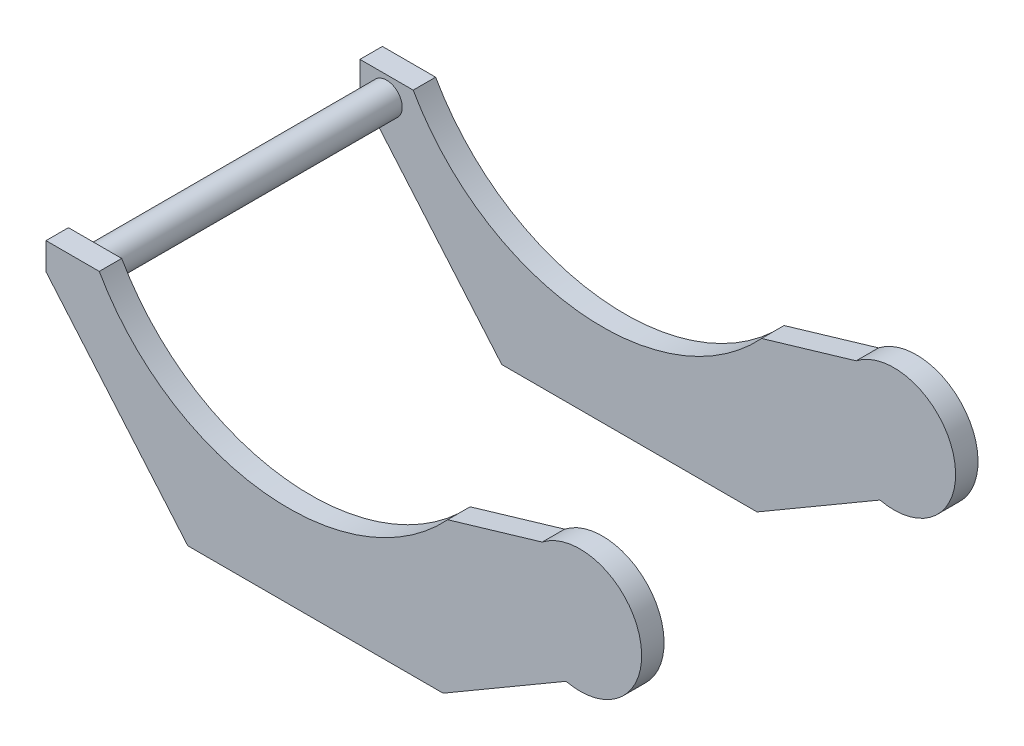
ISO-10303-21;
HEADER;
FILE_DESCRIPTION(('STEP AP214'),'2;1');
FILE_NAME('part.step','',(''),(''),'','','');
FILE_SCHEMA(('AUTOMOTIVE_DESIGN { 1 0 10303 214 1 1 1 1 }'));
ENDSEC;
DATA;
#1=APPLICATION_CONTEXT('core data for automotive mechanical design processes');
#2=APPLICATION_PROTOCOL_DEFINITION('international standard','automotive_design',2000,#1);
#3=PRODUCT_CONTEXT('',#1,'mechanical');
#4=PRODUCT('Part','Part','',(#3));
#5=PRODUCT_RELATED_PRODUCT_CATEGORY('part','',(#4));
#6=PRODUCT_DEFINITION_FORMATION('','',#4);
#7=PRODUCT_DEFINITION_CONTEXT('part definition',#1,'design');
#8=PRODUCT_DEFINITION('design','',#6,#7);
#9=PRODUCT_DEFINITION_SHAPE('','',#8);
#10=(LENGTH_UNIT() NAMED_UNIT(*) SI_UNIT(.MILLI.,.METRE.));
#11=(NAMED_UNIT(*) PLANE_ANGLE_UNIT() SI_UNIT($,.RADIAN.));
#12=(NAMED_UNIT(*) SI_UNIT($,.STERADIAN.) SOLID_ANGLE_UNIT());
#13=UNCERTAINTY_MEASURE_WITH_UNIT(LENGTH_MEASURE(1.E-05),#10,'distance_accuracy_value','');
#14=(GEOMETRIC_REPRESENTATION_CONTEXT(3) GLOBAL_UNCERTAINTY_ASSIGNED_CONTEXT((#13)) GLOBAL_UNIT_ASSIGNED_CONTEXT((#10,
#11,#12)) REPRESENTATION_CONTEXT('',''));
#15=CARTESIAN_POINT('',(0.,0.,0.));
#16=DIRECTION('',(0.,0.,1.));
#17=DIRECTION('',(1.,0.,0.));
#18=AXIS2_PLACEMENT_3D('',#15,#16,#17);
#19=CARTESIAN_POINT('',(-101.5,-3.62645786111999,-3.88949581364922));
#20=DIRECTION('',(0.,0.,1.));
#21=DIRECTION('',(1.,0.,0.));
#22=AXIS2_PLACEMENT_3D('',#19,#20,#21);
#23=CYLINDRICAL_SURFACE('',#22,2.78935799498713);
#24=CARTESIAN_POINT('',(-101.5,-3.62645786111999,4.));
#25=DIRECTION('',(0.,0.,1.));
#26=DIRECTION('',(1.,0.,0.));
#27=AXIS2_PLACEMENT_3D('',#24,#25,#26);
#28=CIRCLE('',#27,2.78935799498713);
#29=CARTESIAN_POINT('',(-98.7106420050129,-3.62645786111999,4.));
#30=VERTEX_POINT('',#29);
#31=EDGE_CURVE('E157',#30,#30,#28,.F.);
#32=ORIENTED_EDGE('',*,*,#31,.F.);
#33=EDGE_LOOP('',(#32));
#34=FACE_BOUND('',#33,.T.);
#35=CARTESIAN_POINT('',(-101.5,-3.62645786111999,56.));
#36=DIRECTION('',(0.,0.,1.));
#37=DIRECTION('',(1.,0.,0.));
#38=AXIS2_PLACEMENT_3D('',#35,#36,#37);
#39=CIRCLE('',#38,2.78935799498713);
#40=CARTESIAN_POINT('',(-98.7106420050129,-3.62645786111999,56.));
#41=VERTEX_POINT('',#40);
#42=EDGE_CURVE('E49',#41,#41,#39,.F.);
#43=ORIENTED_EDGE('',*,*,#42,.T.);
#44=EDGE_LOOP('',(#43));
#45=FACE_BOUND('',#44,.T.);
#46=ADVANCED_FACE('F45',(#34,#45),#23,.T.);
#47=CARTESIAN_POINT('',(-106.25,-4.81395348837209,4.));
#48=DIRECTION('',(1.,0.,0.));
#49=DIRECTION('',(0.,0.,-1.));
#50=AXIS2_PLACEMENT_3D('',#47,#48,#49);
#51=PLANE('',#50);
#52=DIRECTION('',(0.,-1.,0.));
#53=VECTOR('',#52,1.);
#54=CARTESIAN_POINT('',(-106.25,-4.81395348837209,0.));
#55=LINE('',#54,#53);
#56=CARTESIAN_POINT('',(-106.25,0.,0.));
#57=VERTEX_POINT('',#56);
#58=CARTESIAN_POINT('',(-106.25,-4.81395348837209,0.));
#59=VERTEX_POINT('',#58);
#60=EDGE_CURVE('E152',#57,#59,#55,.T.);
#61=ORIENTED_EDGE('',*,*,#60,.T.);
#62=DIRECTION('',(0.,0.,-1.));
#63=VECTOR('',#62,1.);
#64=CARTESIAN_POINT('',(-106.25,-4.81395348837209,4.));
#65=LINE('',#64,#63);
#66=CARTESIAN_POINT('',(-106.25,-4.81395348837209,4.));
#67=VERTEX_POINT('',#66);
#68=EDGE_CURVE('E11',#67,#59,#65,.T.);
#69=ORIENTED_EDGE('',*,*,#68,.F.);
#70=DIRECTION('',(0.,-1.,0.));
#71=VECTOR('',#70,1.);
#72=CARTESIAN_POINT('',(-106.25,-4.81395348837209,4.));
#73=LINE('',#72,#71);
#74=CARTESIAN_POINT('',(-106.25,0.,4.));
#75=VERTEX_POINT('',#74);
#76=EDGE_CURVE('E175',#75,#67,#73,.T.);
#77=ORIENTED_EDGE('',*,*,#76,.F.);
#78=DIRECTION('',(0.,0.,-1.));
#79=VECTOR('',#78,1.);
#80=CARTESIAN_POINT('',(-106.25,0.,4.));
#81=LINE('',#80,#79);
#82=EDGE_CURVE('E148',#75,#57,#81,.T.);
#83=ORIENTED_EDGE('',*,*,#82,.T.);
#84=EDGE_LOOP('',(#61,#69,#77,#83));
#85=FACE_BOUND('',#84,.T.);
#86=ADVANCED_FACE('F47',(#85),#51,.F.);
#87=CARTESIAN_POINT('',(-80.9523809523809,-34.5,4.));
#88=DIRECTION('',(0.761122912956319,0.648607671379924,0.));
#89=DIRECTION('',(-0.648607671379924,0.761122912956319,0.));
#90=AXIS2_PLACEMENT_3D('',#87,#88,#89);
#91=PLANE('',#90);
#92=DIRECTION('',(0.648607671379924,-0.761122912956319,0.));
#93=VECTOR('',#92,1.);
#94=CARTESIAN_POINT('',(-80.9523809523809,-34.5,0.));
#95=LINE('',#94,#93);
#96=CARTESIAN_POINT('',(-80.9523809523809,-34.5,0.));
#97=VERTEX_POINT('',#96);
#98=EDGE_CURVE('E156',#59,#97,#95,.T.);
#99=ORIENTED_EDGE('',*,*,#98,.T.);
#100=DIRECTION('',(0.,0.,-1.));
#101=VECTOR('',#100,1.);
#102=CARTESIAN_POINT('',(-80.9523809523809,-34.5,4.));
#103=LINE('',#102,#101);
#104=CARTESIAN_POINT('',(-80.9523809523809,-34.5,4.));
#105=VERTEX_POINT('',#104);
#106=EDGE_CURVE('E56',#105,#97,#103,.T.);
#107=ORIENTED_EDGE('',*,*,#106,.F.);
#108=DIRECTION('',(0.648607671379924,-0.761122912956319,0.));
#109=VECTOR('',#108,1.);
#110=CARTESIAN_POINT('',(-80.9523809523809,-34.5,4.));
#111=LINE('',#110,#109);
#112=EDGE_CURVE('E108',#67,#105,#111,.T.);
#113=ORIENTED_EDGE('',*,*,#112,.F.);
#114=ORIENTED_EDGE('',*,*,#68,.T.);
#115=EDGE_LOOP('',(#99,#107,#113,#114));
#116=FACE_BOUND('',#115,.T.);
#117=ADVANCED_FACE('F378',(#116),#91,.F.);
#118=CARTESIAN_POINT('',(-35.4166666666666,-34.5,4.));
#119=DIRECTION('',(0.,1.,0.));
#120=DIRECTION('',(-1.,0.,0.));
#121=AXIS2_PLACEMENT_3D('',#118,#119,#120);
#122=PLANE('',#121);
#123=DIRECTION('',(1.,0.,0.));
#124=VECTOR('',#123,1.);
#125=CARTESIAN_POINT('',(-35.4166666666666,-34.5,0.));
#126=LINE('',#125,#124);
#127=CARTESIAN_POINT('',(-35.4166666666666,-34.5,0.));
#128=VERTEX_POINT('',#127);
#129=EDGE_CURVE('E160',#97,#128,#126,.T.);
#130=ORIENTED_EDGE('',*,*,#129,.T.);
#131=DIRECTION('',(0.,0.,-1.));
#132=VECTOR('',#131,1.);
#133=CARTESIAN_POINT('',(-35.4166666666666,-34.5,4.));
#134=LINE('',#133,#132);
#135=CARTESIAN_POINT('',(-35.4166666666666,-34.5,4.));
#136=VERTEX_POINT('',#135);
#137=EDGE_CURVE('E186',#136,#128,#134,.T.);
#138=ORIENTED_EDGE('',*,*,#137,.F.);
#139=DIRECTION('',(1.,0.,0.));
#140=VECTOR('',#139,1.);
#141=CARTESIAN_POINT('',(-35.4166666666666,-34.5,4.));
#142=LINE('',#141,#140);
#143=EDGE_CURVE('E197',#105,#136,#142,.T.);
#144=ORIENTED_EDGE('',*,*,#143,.F.);
#145=ORIENTED_EDGE('',*,*,#106,.T.);
#146=EDGE_LOOP('',(#130,#138,#144,#145));
#147=FACE_BOUND('',#146,.T.);
#148=ADVANCED_FACE('F195',(#147),#122,.F.);
#149=CARTESIAN_POINT('',(-13.4920634920635,-21.6978501735579,4.));
#150=DIRECTION('',(-0.504247080861031,0.863559425542405,0.));
#151=DIRECTION('',(-0.863559425542405,-0.504247080861031,0.));
#152=AXIS2_PLACEMENT_3D('',#149,#150,#151);
#153=PLANE('',#152);
#154=DIRECTION('',(0.863559425542405,0.504247080861031,0.));
#155=VECTOR('',#154,1.);
#156=CARTESIAN_POINT('',(-13.4920634920635,-21.6978501735579,0.));
#157=LINE('',#156,#155);
#158=CARTESIAN_POINT('',(-13.4920634920635,-21.6978501735579,0.));
#159=VERTEX_POINT('',#158);
#160=EDGE_CURVE('E163',#128,#159,#157,.T.);
#161=ORIENTED_EDGE('',*,*,#160,.T.);
#162=DIRECTION('',(0.,0.,-1.));
#163=VECTOR('',#162,1.);
#164=CARTESIAN_POINT('',(-13.4920634920635,-21.6978501735579,4.));
#165=LINE('',#164,#163);
#166=CARTESIAN_POINT('',(-13.4920634920635,-21.6978501735579,4.));
#167=VERTEX_POINT('',#166);
#168=EDGE_CURVE('E182',#167,#159,#165,.T.);
#169=ORIENTED_EDGE('',*,*,#168,.F.);
#170=DIRECTION('',(0.863559425542405,0.504247080861031,0.));
#171=VECTOR('',#170,1.);
#172=CARTESIAN_POINT('',(-13.4920634920635,-21.6978501735579,4.));
#173=LINE('',#172,#171);
#174=EDGE_CURVE('E210',#136,#167,#173,.T.);
#175=ORIENTED_EDGE('',*,*,#174,.F.);
#176=ORIENTED_EDGE('',*,*,#137,.T.);
#177=EDGE_LOOP('',(#161,#169,#175,#176));
#178=FACE_BOUND('',#177,.T.);
#179=ADVANCED_FACE('F205',(#178),#153,.F.);
#180=CARTESIAN_POINT('',(-10.9928571428571,-10.9928571428571,4.));
#181=DIRECTION('',(0.,0.,-1.));
#182=DIRECTION('',(-1.,0.,0.));
#183=AXIS2_PLACEMENT_3D('',#180,#181,#182);
#184=CYLINDRICAL_SURFACE('',#183,10.9928571428571);
#185=CARTESIAN_POINT('',(-10.9928571428571,-10.9928571428571,0.));
#186=DIRECTION('',(0.,0.,1.));
#187=DIRECTION('',(-1.,0.,0.));
#188=AXIS2_PLACEMENT_3D('',#185,#186,#187);
#189=CIRCLE('',#188,10.9928571428571);
#190=CARTESIAN_POINT('',(-17.7388888888889,-2.31334311010179,0.));
#191=VERTEX_POINT('',#190);
#192=EDGE_CURVE('E166',#159,#191,#189,.T.);
#193=ORIENTED_EDGE('',*,*,#192,.T.);
#194=DIRECTION('',(0.,0.,-1.));
#195=VECTOR('',#194,1.);
#196=CARTESIAN_POINT('',(-17.7388888888889,-2.31334311010179,4.));
#197=LINE('',#196,#195);
#198=CARTESIAN_POINT('',(-17.7388888888889,-2.31334311010179,4.));
#199=VERTEX_POINT('',#198);
#200=EDGE_CURVE('E141',#199,#191,#197,.T.);
#201=ORIENTED_EDGE('',*,*,#200,.F.);
#202=CARTESIAN_POINT('',(-10.9928571428571,-10.9928571428571,4.));
#203=DIRECTION('',(0.,0.,1.));
#204=DIRECTION('',(-1.,0.,0.));
#205=AXIS2_PLACEMENT_3D('',#202,#203,#204);
#206=CIRCLE('',#205,10.9928571428571);
#207=EDGE_CURVE('E130',#167,#199,#206,.T.);
#208=ORIENTED_EDGE('',*,*,#207,.F.);
#209=ORIENTED_EDGE('',*,*,#168,.T.);
#210=EDGE_LOOP('',(#193,#201,#208,#209));
#211=FACE_BOUND('',#210,.T.);
#212=ADVANCED_FACE('F208',(#211),#184,.T.);
#213=CARTESIAN_POINT('',(-34.6039682539683,-7.29236612624806,4.));
#214=DIRECTION('',(0.283145224915242,-0.959077046752604,0.));
#215=DIRECTION('',(0.959077046752604,0.283145224915242,0.));
#216=AXIS2_PLACEMENT_3D('',#213,#214,#215);
#217=PLANE('',#216);
#218=DIRECTION('',(-0.959077046752604,-0.283145224915242,0.));
#219=VECTOR('',#218,1.);
#220=CARTESIAN_POINT('',(-34.6039682539683,-7.29236612624806,0.));
#221=LINE('',#220,#219);
#222=CARTESIAN_POINT('',(-34.6039682539683,-7.29236612624809,0.));
#223=VERTEX_POINT('',#222);
#224=EDGE_CURVE('E139',#191,#223,#221,.T.);
#225=ORIENTED_EDGE('',*,*,#224,.T.);
#226=DIRECTION('',(0.,0.,-1.));
#227=VECTOR('',#226,1.);
#228=CARTESIAN_POINT('',(-34.6039682539683,-7.29236612624809,4.));
#229=LINE('',#228,#227);
#230=CARTESIAN_POINT('',(-34.6039682539683,-7.29236612624809,4.));
#231=VERTEX_POINT('',#230);
#232=EDGE_CURVE('E136',#231,#223,#229,.T.);
#233=ORIENTED_EDGE('',*,*,#232,.F.);
#234=DIRECTION('',(-0.959077046752604,-0.283145224915242,0.));
#235=VECTOR('',#234,1.);
#236=CARTESIAN_POINT('',(-34.6039682539683,-7.29236612624806,4.));
#237=LINE('',#236,#235);
#238=EDGE_CURVE('E124',#199,#231,#237,.T.);
#239=ORIENTED_EDGE('',*,*,#238,.F.);
#240=ORIENTED_EDGE('',*,*,#200,.T.);
#241=EDGE_LOOP('',(#225,#233,#239,#240));
#242=FACE_BOUND('',#241,.T.);
#243=ADVANCED_FACE('F137',(#242),#217,.F.);
#244=CARTESIAN_POINT('',(-63.0198412698413,18.9981660404366,4.));
#245=DIRECTION('',(0.,0.,-1.));
#246=DIRECTION('',(-1.,0.,0.));
#247=AXIS2_PLACEMENT_3D('',#244,#245,#246);
#248=CYLINDRICAL_SURFACE('',#247,38.7124517547223);
#249=CARTESIAN_POINT('',(-63.0198412698413,18.9981660404366,0.));
#250=DIRECTION('',(0.,0.,-1.));
#251=DIRECTION('',(1.,0.,0.));
#252=AXIS2_PLACEMENT_3D('',#249,#250,#251);
#253=CIRCLE('',#252,38.7124517547223);
#254=CARTESIAN_POINT('',(-96.75,0.,0.));
#255=VERTEX_POINT('',#254);
#256=EDGE_CURVE('E94',#223,#255,#253,.T.);
#257=ORIENTED_EDGE('',*,*,#256,.T.);
#258=DIRECTION('',(0.,0.,-1.));
#259=VECTOR('',#258,1.);
#260=CARTESIAN_POINT('',(-96.75,0.,4.));
#261=LINE('',#260,#259);
#262=CARTESIAN_POINT('',(-96.75,0.,4.));
#263=VERTEX_POINT('',#262);
#264=EDGE_CURVE('E142',#263,#255,#261,.T.);
#265=ORIENTED_EDGE('',*,*,#264,.F.);
#266=CARTESIAN_POINT('',(-63.0198412698413,18.9981660404366,4.));
#267=DIRECTION('',(0.,0.,-1.));
#268=DIRECTION('',(1.,0.,0.));
#269=AXIS2_PLACEMENT_3D('',#266,#267,#268);
#270=CIRCLE('',#269,38.7124517547223);
#271=EDGE_CURVE('E128',#231,#263,#270,.T.);
#272=ORIENTED_EDGE('',*,*,#271,.F.);
#273=ORIENTED_EDGE('',*,*,#232,.T.);
#274=EDGE_LOOP('',(#257,#265,#272,#273));
#275=FACE_BOUND('',#274,.T.);
#276=ADVANCED_FACE('F144',(#275),#248,.F.);
#277=CARTESIAN_POINT('',(-106.25,0.,4.));
#278=DIRECTION('',(0.,-1.,0.));
#279=DIRECTION('',(0.,0.,-1.));
#280=AXIS2_PLACEMENT_3D('',#277,#278,#279);
#281=PLANE('',#280);
#282=DIRECTION('',(-1.,0.,0.));
#283=VECTOR('',#282,1.);
#284=CARTESIAN_POINT('',(-106.25,0.,0.));
#285=LINE('',#284,#283);
#286=EDGE_CURVE('E100',#255,#57,#285,.T.);
#287=ORIENTED_EDGE('',*,*,#286,.T.);
#288=ORIENTED_EDGE('',*,*,#82,.F.);
#289=DIRECTION('',(-1.,0.,0.));
#290=VECTOR('',#289,1.);
#291=CARTESIAN_POINT('',(-106.25,0.,4.));
#292=LINE('',#291,#290);
#293=EDGE_CURVE('E64',#263,#75,#292,.T.);
#294=ORIENTED_EDGE('',*,*,#293,.F.);
#295=ORIENTED_EDGE('',*,*,#264,.T.);
#296=EDGE_LOOP('',(#287,#288,#294,#295));
#297=FACE_BOUND('',#296,.T.);
#298=ADVANCED_FACE('F385',(#297),#281,.F.);
#299=CARTESIAN_POINT('',(-63.0198412698413,18.9981660404366,4.));
#300=DIRECTION('',(0.,0.,1.));
#301=DIRECTION('',(1.,0.,0.));
#302=AXIS2_PLACEMENT_3D('',#299,#300,#301);
#303=PLANE('',#302);
#304=ORIENTED_EDGE('',*,*,#31,.T.);
#305=EDGE_LOOP('',(#304));
#306=FACE_BOUND('',#305,.T.);
#307=ORIENTED_EDGE('',*,*,#76,.T.);
#308=ORIENTED_EDGE('',*,*,#112,.T.);
#309=ORIENTED_EDGE('',*,*,#143,.T.);
#310=ORIENTED_EDGE('',*,*,#174,.T.);
#311=ORIENTED_EDGE('',*,*,#207,.T.);
#312=ORIENTED_EDGE('',*,*,#238,.T.);
#313=ORIENTED_EDGE('',*,*,#271,.T.);
#314=ORIENTED_EDGE('',*,*,#293,.T.);
#315=EDGE_LOOP('',(#307,#308,#309,#310,#311,#312,#313,#314));
#316=FACE_BOUND('',#315,.T.);
#317=ADVANCED_FACE('F126',(#306,#316),#303,.T.);
#318=CARTESIAN_POINT('',(-63.0198412698413,18.9981660404366,0.));
#319=DIRECTION('',(0.,0.,1.));
#320=DIRECTION('',(1.,0.,0.));
#321=AXIS2_PLACEMENT_3D('',#318,#319,#320);
#322=PLANE('',#321);
#323=ORIENTED_EDGE('',*,*,#60,.F.);
#324=ORIENTED_EDGE('',*,*,#286,.F.);
#325=ORIENTED_EDGE('',*,*,#256,.F.);
#326=ORIENTED_EDGE('',*,*,#224,.F.);
#327=ORIENTED_EDGE('',*,*,#192,.F.);
#328=ORIENTED_EDGE('',*,*,#160,.F.);
#329=ORIENTED_EDGE('',*,*,#129,.F.);
#330=ORIENTED_EDGE('',*,*,#98,.F.);
#331=EDGE_LOOP('',(#323,#324,#325,#326,#327,#328,#329,#330));
#332=FACE_BOUND('',#331,.T.);
#333=ADVANCED_FACE('F201',(#332),#322,.F.);
#334=CARTESIAN_POINT('',(-106.25,-4.81395348837209,60.));
#335=DIRECTION('',(1.,0.,0.));
#336=DIRECTION('',(0.,0.,-1.));
#337=AXIS2_PLACEMENT_3D('',#334,#335,#336);
#338=PLANE('',#337);
#339=DIRECTION('',(0.,-1.,0.));
#340=VECTOR('',#339,1.);
#341=CARTESIAN_POINT('',(-106.25,-4.81395348837209,56.));
#342=LINE('',#341,#340);
#343=CARTESIAN_POINT('',(-106.25,0.,56.));
#344=VERTEX_POINT('',#343);
#345=CARTESIAN_POINT('',(-106.25,-4.81395348837209,56.));
#346=VERTEX_POINT('',#345);
#347=EDGE_CURVE('E285',#344,#346,#342,.T.);
#348=ORIENTED_EDGE('',*,*,#347,.T.);
#349=DIRECTION('',(0.,0.,-1.));
#350=VECTOR('',#349,1.);
#351=CARTESIAN_POINT('',(-106.25,-4.81395348837209,60.));
#352=LINE('',#351,#350);
#353=CARTESIAN_POINT('',(-106.25,-4.81395348837209,60.));
#354=VERTEX_POINT('',#353);
#355=EDGE_CURVE('E223',#354,#346,#352,.T.);
#356=ORIENTED_EDGE('',*,*,#355,.F.);
#357=DIRECTION('',(0.,-1.,0.));
#358=VECTOR('',#357,1.);
#359=CARTESIAN_POINT('',(-106.25,-4.81395348837209,60.));
#360=LINE('',#359,#358);
#361=CARTESIAN_POINT('',(-106.25,0.,60.));
#362=VERTEX_POINT('',#361);
#363=EDGE_CURVE('E260',#362,#354,#360,.T.);
#364=ORIENTED_EDGE('',*,*,#363,.F.);
#365=DIRECTION('',(0.,0.,-1.));
#366=VECTOR('',#365,1.);
#367=CARTESIAN_POINT('',(-106.25,0.,60.));
#368=LINE('',#367,#366);
#369=EDGE_CURVE('E251',#362,#344,#368,.T.);
#370=ORIENTED_EDGE('',*,*,#369,.T.);
#371=EDGE_LOOP('',(#348,#356,#364,#370));
#372=FACE_BOUND('',#371,.T.);
#373=ADVANCED_FACE('F330',(#372),#338,.F.);
#374=CARTESIAN_POINT('',(-80.9523809523809,-34.5,60.));
#375=DIRECTION('',(0.761122912956319,0.648607671379924,0.));
#376=DIRECTION('',(-0.648607671379924,0.761122912956319,0.));
#377=AXIS2_PLACEMENT_3D('',#374,#375,#376);
#378=PLANE('',#377);
#379=DIRECTION('',(0.648607671379924,-0.761122912956319,0.));
#380=VECTOR('',#379,1.);
#381=CARTESIAN_POINT('',(-80.9523809523809,-34.5,56.));
#382=LINE('',#381,#380);
#383=CARTESIAN_POINT('',(-80.9523809523809,-34.5,56.));
#384=VERTEX_POINT('',#383);
#385=EDGE_CURVE('E281',#346,#384,#382,.T.);
#386=ORIENTED_EDGE('',*,*,#385,.T.);
#387=DIRECTION('',(0.,0.,-1.));
#388=VECTOR('',#387,1.);
#389=CARTESIAN_POINT('',(-80.9523809523809,-34.5,60.));
#390=LINE('',#389,#388);
#391=CARTESIAN_POINT('',(-80.9523809523809,-34.5,60.));
#392=VERTEX_POINT('',#391);
#393=EDGE_CURVE('E227',#392,#384,#390,.T.);
#394=ORIENTED_EDGE('',*,*,#393,.F.);
#395=DIRECTION('',(0.648607671379924,-0.761122912956319,0.));
#396=VECTOR('',#395,1.);
#397=CARTESIAN_POINT('',(-80.9523809523809,-34.5,60.));
#398=LINE('',#397,#396);
#399=EDGE_CURVE('E312',#354,#392,#398,.T.);
#400=ORIENTED_EDGE('',*,*,#399,.F.);
#401=ORIENTED_EDGE('',*,*,#355,.T.);
#402=EDGE_LOOP('',(#386,#394,#400,#401));
#403=FACE_BOUND('',#402,.T.);
#404=ADVANCED_FACE('F334',(#403),#378,.F.);
#405=CARTESIAN_POINT('',(-35.4166666666666,-34.5,60.));
#406=DIRECTION('',(0.,1.,0.));
#407=DIRECTION('',(-1.,0.,0.));
#408=AXIS2_PLACEMENT_3D('',#405,#406,#407);
#409=PLANE('',#408);
#410=DIRECTION('',(1.,0.,0.));
#411=VECTOR('',#410,1.);
#412=CARTESIAN_POINT('',(-35.4166666666666,-34.5,56.));
#413=LINE('',#412,#411);
#414=CARTESIAN_POINT('',(-35.4166666666666,-34.5,56.));
#415=VERTEX_POINT('',#414);
#416=EDGE_CURVE('E277',#384,#415,#413,.T.);
#417=ORIENTED_EDGE('',*,*,#416,.T.);
#418=DIRECTION('',(0.,0.,-1.));
#419=VECTOR('',#418,1.);
#420=CARTESIAN_POINT('',(-35.4166666666666,-34.5,60.));
#421=LINE('',#420,#419);
#422=CARTESIAN_POINT('',(-35.4166666666666,-34.5,60.));
#423=VERTEX_POINT('',#422);
#424=EDGE_CURVE('E231',#423,#415,#421,.T.);
#425=ORIENTED_EDGE('',*,*,#424,.F.);
#426=DIRECTION('',(1.,0.,0.));
#427=VECTOR('',#426,1.);
#428=CARTESIAN_POINT('',(-35.4166666666666,-34.5,60.));
#429=LINE('',#428,#427);
#430=EDGE_CURVE('E308',#392,#423,#429,.T.);
#431=ORIENTED_EDGE('',*,*,#430,.F.);
#432=ORIENTED_EDGE('',*,*,#393,.T.);
#433=EDGE_LOOP('',(#417,#425,#431,#432));
#434=FACE_BOUND('',#433,.T.);
#435=ADVANCED_FACE('F461',(#434),#409,.F.);
#436=CARTESIAN_POINT('',(-13.4920634920635,-21.6978501735579,60.));
#437=DIRECTION('',(-0.504247080861031,0.863559425542405,0.));
#438=DIRECTION('',(-0.863559425542405,-0.504247080861031,0.));
#439=AXIS2_PLACEMENT_3D('',#436,#437,#438);
#440=PLANE('',#439);
#441=DIRECTION('',(0.863559425542405,0.504247080861031,0.));
#442=VECTOR('',#441,1.);
#443=CARTESIAN_POINT('',(-13.4920634920635,-21.6978501735579,56.));
#444=LINE('',#443,#442);
#445=CARTESIAN_POINT('',(-13.4920634920635,-21.6978501735579,56.));
#446=VERTEX_POINT('',#445);
#447=EDGE_CURVE('E273',#415,#446,#444,.T.);
#448=ORIENTED_EDGE('',*,*,#447,.T.);
#449=DIRECTION('',(0.,0.,-1.));
#450=VECTOR('',#449,1.);
#451=CARTESIAN_POINT('',(-13.4920634920635,-21.6978501735579,60.));
#452=LINE('',#451,#450);
#453=CARTESIAN_POINT('',(-13.4920634920635,-21.6978501735579,60.));
#454=VERTEX_POINT('',#453);
#455=EDGE_CURVE('E235',#454,#446,#452,.T.);
#456=ORIENTED_EDGE('',*,*,#455,.F.);
#457=DIRECTION('',(0.863559425542405,0.504247080861031,0.));
#458=VECTOR('',#457,1.);
#459=CARTESIAN_POINT('',(-13.4920634920635,-21.6978501735579,60.));
#460=LINE('',#459,#458);
#461=EDGE_CURVE('E304',#423,#454,#460,.T.);
#462=ORIENTED_EDGE('',*,*,#461,.F.);
#463=ORIENTED_EDGE('',*,*,#424,.T.);
#464=EDGE_LOOP('',(#448,#456,#462,#463));
#465=FACE_BOUND('',#464,.T.);
#466=ADVANCED_FACE('F469',(#465),#440,.F.);
#467=CARTESIAN_POINT('',(-10.9928571428571,-10.9928571428571,60.));
#468=DIRECTION('',(0.,0.,-1.));
#469=DIRECTION('',(-1.,0.,0.));
#470=AXIS2_PLACEMENT_3D('',#467,#468,#469);
#471=CYLINDRICAL_SURFACE('',#470,10.9928571428571);
#472=CARTESIAN_POINT('',(-10.9928571428571,-10.9928571428571,56.));
#473=DIRECTION('',(0.,0.,1.));
#474=DIRECTION('',(-1.,0.,0.));
#475=AXIS2_PLACEMENT_3D('',#472,#473,#474);
#476=CIRCLE('',#475,10.9928571428571);
#477=CARTESIAN_POINT('',(-17.7388888888889,-2.31334311010179,56.));
#478=VERTEX_POINT('',#477);
#479=EDGE_CURVE('E269',#446,#478,#476,.T.);
#480=ORIENTED_EDGE('',*,*,#479,.T.);
#481=DIRECTION('',(0.,0.,-1.));
#482=VECTOR('',#481,1.);
#483=CARTESIAN_POINT('',(-17.7388888888889,-2.31334311010179,60.));
#484=LINE('',#483,#482);
#485=CARTESIAN_POINT('',(-17.7388888888889,-2.31334311010179,60.));
#486=VERTEX_POINT('',#485);
#487=EDGE_CURVE('E239',#486,#478,#484,.T.);
#488=ORIENTED_EDGE('',*,*,#487,.F.);
#489=CARTESIAN_POINT('',(-10.9928571428571,-10.9928571428571,60.));
#490=DIRECTION('',(0.,0.,1.));
#491=DIRECTION('',(-1.,0.,0.));
#492=AXIS2_PLACEMENT_3D('',#489,#490,#491);
#493=CIRCLE('',#492,10.9928571428571);
#494=EDGE_CURVE('E300',#454,#486,#493,.T.);
#495=ORIENTED_EDGE('',*,*,#494,.F.);
#496=ORIENTED_EDGE('',*,*,#455,.T.);
#497=EDGE_LOOP('',(#480,#488,#495,#496));
#498=FACE_BOUND('',#497,.T.);
#499=ADVANCED_FACE('F478',(#498),#471,.T.);
#500=CARTESIAN_POINT('',(-34.6039682539683,-7.29236612624806,60.));
#501=DIRECTION('',(0.283145224915242,-0.959077046752604,0.));
#502=DIRECTION('',(0.959077046752604,0.283145224915242,0.));
#503=AXIS2_PLACEMENT_3D('',#500,#501,#502);
#504=PLANE('',#503);
#505=DIRECTION('',(-0.959077046752604,-0.283145224915242,0.));
#506=VECTOR('',#505,1.);
#507=CARTESIAN_POINT('',(-34.6039682539683,-7.29236612624806,56.));
#508=LINE('',#507,#506);
#509=CARTESIAN_POINT('',(-34.6039682539683,-7.29236612624809,56.));
#510=VERTEX_POINT('',#509);
#511=EDGE_CURVE('E265',#478,#510,#508,.T.);
#512=ORIENTED_EDGE('',*,*,#511,.T.);
#513=DIRECTION('',(0.,0.,-1.));
#514=VECTOR('',#513,1.);
#515=CARTESIAN_POINT('',(-34.6039682539683,-7.29236612624809,60.));
#516=LINE('',#515,#514);
#517=CARTESIAN_POINT('',(-34.6039682539683,-7.29236612624809,60.));
#518=VERTEX_POINT('',#517);
#519=EDGE_CURVE('E243',#518,#510,#516,.T.);
#520=ORIENTED_EDGE('',*,*,#519,.F.);
#521=DIRECTION('',(-0.959077046752604,-0.283145224915242,0.));
#522=VECTOR('',#521,1.);
#523=CARTESIAN_POINT('',(-34.6039682539683,-7.29236612624806,60.));
#524=LINE('',#523,#522);
#525=EDGE_CURVE('E296',#486,#518,#524,.T.);
#526=ORIENTED_EDGE('',*,*,#525,.F.);
#527=ORIENTED_EDGE('',*,*,#487,.T.);
#528=EDGE_LOOP('',(#512,#520,#526,#527));
#529=FACE_BOUND('',#528,.T.);
#530=ADVANCED_FACE('F487',(#529),#504,.F.);
#531=CARTESIAN_POINT('',(-63.0198412698413,18.9981660404366,60.));
#532=DIRECTION('',(0.,0.,-1.));
#533=DIRECTION('',(-1.,0.,0.));
#534=AXIS2_PLACEMENT_3D('',#531,#532,#533);
#535=CYLINDRICAL_SURFACE('',#534,38.7124517547223);
#536=CARTESIAN_POINT('',(-63.0198412698413,18.9981660404366,56.));
#537=DIRECTION('',(0.,0.,-1.));
#538=DIRECTION('',(1.,0.,0.));
#539=AXIS2_PLACEMENT_3D('',#536,#537,#538);
#540=CIRCLE('',#539,38.7124517547223);
#541=CARTESIAN_POINT('',(-96.75,0.,56.));
#542=VERTEX_POINT('',#541);
#543=EDGE_CURVE('E261',#510,#542,#540,.T.);
#544=ORIENTED_EDGE('',*,*,#543,.T.);
#545=DIRECTION('',(0.,0.,-1.));
#546=VECTOR('',#545,1.);
#547=CARTESIAN_POINT('',(-96.75,0.,60.));
#548=LINE('',#547,#546);
#549=CARTESIAN_POINT('',(-96.75,0.,60.));
#550=VERTEX_POINT('',#549);
#551=EDGE_CURVE('E247',#550,#542,#548,.T.);
#552=ORIENTED_EDGE('',*,*,#551,.F.);
#553=CARTESIAN_POINT('',(-63.0198412698413,18.9981660404366,60.));
#554=DIRECTION('',(0.,0.,-1.));
#555=DIRECTION('',(1.,0.,0.));
#556=AXIS2_PLACEMENT_3D('',#553,#554,#555);
#557=CIRCLE('',#556,38.7124517547223);
#558=EDGE_CURVE('E292',#518,#550,#557,.T.);
#559=ORIENTED_EDGE('',*,*,#558,.F.);
#560=ORIENTED_EDGE('',*,*,#519,.T.);
#561=EDGE_LOOP('',(#544,#552,#559,#560));
#562=FACE_BOUND('',#561,.T.);
#563=ADVANCED_FACE('F367',(#562),#535,.F.);
#564=CARTESIAN_POINT('',(-106.25,0.,60.));
#565=DIRECTION('',(0.,-1.,0.));
#566=DIRECTION('',(0.,0.,-1.));
#567=AXIS2_PLACEMENT_3D('',#564,#565,#566);
#568=PLANE('',#567);
#569=DIRECTION('',(-1.,0.,0.));
#570=VECTOR('',#569,1.);
#571=CARTESIAN_POINT('',(-106.25,0.,56.));
#572=LINE('',#571,#570);
#573=EDGE_CURVE('E256',#542,#344,#572,.T.);
#574=ORIENTED_EDGE('',*,*,#573,.T.);
#575=ORIENTED_EDGE('',*,*,#369,.F.);
#576=DIRECTION('',(-1.,0.,0.));
#577=VECTOR('',#576,1.);
#578=CARTESIAN_POINT('',(-106.25,0.,60.));
#579=LINE('',#578,#577);
#580=EDGE_CURVE('E255',#550,#362,#579,.T.);
#581=ORIENTED_EDGE('',*,*,#580,.F.);
#582=ORIENTED_EDGE('',*,*,#551,.T.);
#583=EDGE_LOOP('',(#574,#575,#581,#582));
#584=FACE_BOUND('',#583,.T.);
#585=ADVANCED_FACE('F357',(#584),#568,.F.);
#586=CARTESIAN_POINT('',(-63.0198412698413,18.9981660404366,56.));
#587=DIRECTION('',(0.,0.,1.));
#588=DIRECTION('',(1.,0.,0.));
#589=AXIS2_PLACEMENT_3D('',#586,#587,#588);
#590=PLANE('',#589);
#591=ORIENTED_EDGE('',*,*,#42,.F.);
#592=EDGE_LOOP('',(#591));
#593=FACE_BOUND('',#592,.T.);
#594=ORIENTED_EDGE('',*,*,#347,.F.);
#595=ORIENTED_EDGE('',*,*,#573,.F.);
#596=ORIENTED_EDGE('',*,*,#543,.F.);
#597=ORIENTED_EDGE('',*,*,#511,.F.);
#598=ORIENTED_EDGE('',*,*,#479,.F.);
#599=ORIENTED_EDGE('',*,*,#447,.F.);
#600=ORIENTED_EDGE('',*,*,#416,.F.);
#601=ORIENTED_EDGE('',*,*,#385,.F.);
#602=EDGE_LOOP('',(#594,#595,#596,#597,#598,#599,#600,#601));
#603=FACE_BOUND('',#602,.T.);
#604=ADVANCED_FACE('F358',(#593,#603),#590,.F.);
#605=CARTESIAN_POINT('',(-101.5,-3.62645786111999,60.));
#606=DIRECTION('',(0.,0.,1.));
#607=DIRECTION('',(1.,0.,0.));
#608=AXIS2_PLACEMENT_3D('',#605,#606,#607);
#609=PLANE('',#608);
#610=ORIENTED_EDGE('',*,*,#363,.T.);
#611=ORIENTED_EDGE('',*,*,#399,.T.);
#612=ORIENTED_EDGE('',*,*,#430,.T.);
#613=ORIENTED_EDGE('',*,*,#461,.T.);
#614=ORIENTED_EDGE('',*,*,#494,.T.);
#615=ORIENTED_EDGE('',*,*,#525,.T.);
#616=ORIENTED_EDGE('',*,*,#558,.T.);
#617=ORIENTED_EDGE('',*,*,#580,.T.);
#618=EDGE_LOOP('',(#610,#611,#612,#613,#614,#615,#616,#617));
#619=FACE_BOUND('',#618,.T.);
#620=ADVANCED_FACE('F322',(#619),#609,.T.);
#621=CLOSED_SHELL('',(#46,#86,#117,#148,#179,#212,#243,#276,#298,#317,#333,#373,#404,#435,#466,
#499,#530,#563,#585,#604,#620));
#622=MANIFOLD_SOLID_BREP('B2',#621);
#623=ADVANCED_BREP_SHAPE_REPRESENTATION('',(#18,#622),#14);
#624=SHAPE_DEFINITION_REPRESENTATION(#9,#623);
ENDSEC;
END-ISO-10303-21;
